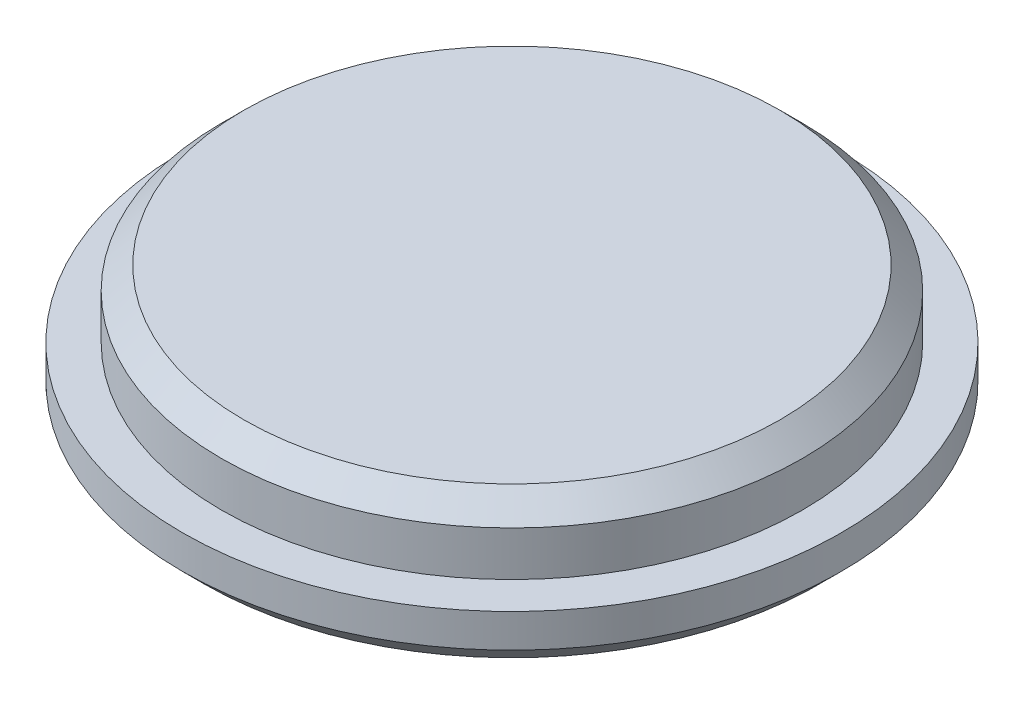
ISO-10303-21;
HEADER;
FILE_DESCRIPTION(('STEP AP214'),'2;1');
FILE_NAME('part.step','',(''),(''),'','','');
FILE_SCHEMA(('AUTOMOTIVE_DESIGN { 1 0 10303 214 1 1 1 1 }'));
ENDSEC;
DATA;
#1=APPLICATION_CONTEXT('core data for automotive mechanical design processes');
#2=APPLICATION_PROTOCOL_DEFINITION('international standard','automotive_design',2000,#1);
#3=PRODUCT_CONTEXT('',#1,'mechanical');
#4=PRODUCT('Part','Part','',(#3));
#5=PRODUCT_RELATED_PRODUCT_CATEGORY('part','',(#4));
#6=PRODUCT_DEFINITION_FORMATION('','',#4);
#7=PRODUCT_DEFINITION_CONTEXT('part definition',#1,'design');
#8=PRODUCT_DEFINITION('design','',#6,#7);
#9=PRODUCT_DEFINITION_SHAPE('','',#8);
#10=(LENGTH_UNIT() NAMED_UNIT(*) SI_UNIT(.MILLI.,.METRE.));
#11=(NAMED_UNIT(*) PLANE_ANGLE_UNIT() SI_UNIT($,.RADIAN.));
#12=(NAMED_UNIT(*) SI_UNIT($,.STERADIAN.) SOLID_ANGLE_UNIT());
#13=UNCERTAINTY_MEASURE_WITH_UNIT(LENGTH_MEASURE(1.E-05),#10,'distance_accuracy_value','');
#14=(GEOMETRIC_REPRESENTATION_CONTEXT(3) GLOBAL_UNCERTAINTY_ASSIGNED_CONTEXT((#13)) GLOBAL_UNIT_ASSIGNED_CONTEXT((#10,
#11,#12)) REPRESENTATION_CONTEXT('',''));
#15=CARTESIAN_POINT('',(0.,0.,0.));
#16=DIRECTION('',(0.,0.,1.));
#17=DIRECTION('',(1.,0.,0.));
#18=AXIS2_PLACEMENT_3D('',#15,#16,#17);
#19=CARTESIAN_POINT('',(0.,0.,0.));
#20=DIRECTION('',(0.,1.,0.));
#21=DIRECTION('',(0.,0.,1.));
#22=AXIS2_PLACEMENT_3D('',#19,#20,#21);
#23=PLANE('',#22);
#24=CARTESIAN_POINT('',(0.,0.,0.));
#25=DIRECTION('',(0.,1.,0.));
#26=DIRECTION('',(0.,0.,1.));
#27=AXIS2_PLACEMENT_3D('',#24,#25,#26);
#28=CIRCLE('',#27,27.5);
#29=CARTESIAN_POINT('',(0.,0.,27.5));
#30=VERTEX_POINT('',#29);
#31=EDGE_CURVE('E10',#30,#30,#28,.T.);
#32=ORIENTED_EDGE('',*,*,#31,.F.);
#33=EDGE_LOOP('',(#32));
#34=FACE_BOUND('',#33,.T.);
#35=ADVANCED_FACE('F43',(#34),#23,.F.);
#36=CARTESIAN_POINT('',(0.,0.,0.));
#37=DIRECTION('',(0.,1.,0.));
#38=DIRECTION('',(0.,0.,1.));
#39=AXIS2_PLACEMENT_3D('',#36,#37,#38);
#40=CONICAL_SURFACE('',#39,27.5,0.785398163397448);
#41=CARTESIAN_POINT('',(0.,2.,0.));
#42=DIRECTION('',(0.,1.,0.));
#43=DIRECTION('',(0.,0.,1.));
#44=AXIS2_PLACEMENT_3D('',#41,#42,#43);
#45=CIRCLE('',#44,29.5);
#46=CARTESIAN_POINT('',(0.,2.,29.5));
#47=VERTEX_POINT('',#46);
#48=EDGE_CURVE('E50',#47,#47,#45,.T.);
#49=ORIENTED_EDGE('',*,*,#48,.F.);
#50=EDGE_LOOP('',(#49));
#51=FACE_BOUND('',#50,.T.);
#52=ORIENTED_EDGE('',*,*,#31,.T.);
#53=EDGE_LOOP('',(#52));
#54=FACE_BOUND('',#53,.T.);
#55=ADVANCED_FACE('F97',(#51,#54),#40,.T.);
#56=CARTESIAN_POINT('',(0.,0.,0.));
#57=DIRECTION('',(0.,1.,0.));
#58=DIRECTION('',(0.,0.,1.));
#59=AXIS2_PLACEMENT_3D('',#56,#57,#58);
#60=CYLINDRICAL_SURFACE('',#59,29.5);
#61=CARTESIAN_POINT('',(0.,5.,0.));
#62=DIRECTION('',(0.,1.,0.));
#63=DIRECTION('',(0.,0.,1.));
#64=AXIS2_PLACEMENT_3D('',#61,#62,#63);
#65=CIRCLE('',#64,29.5);
#66=CARTESIAN_POINT('',(0.,5.,29.5));
#67=VERTEX_POINT('',#66);
#68=EDGE_CURVE('E55',#67,#67,#65,.T.);
#69=ORIENTED_EDGE('',*,*,#68,.F.);
#70=EDGE_LOOP('',(#69));
#71=FACE_BOUND('',#70,.T.);
#72=ORIENTED_EDGE('',*,*,#48,.T.);
#73=EDGE_LOOP('',(#72));
#74=FACE_BOUND('',#73,.T.);
#75=ADVANCED_FACE('F92',(#71,#74),#60,.T.);
#76=CARTESIAN_POINT('',(26.,5.,0.));
#77=DIRECTION('',(0.,-1.,0.));
#78=DIRECTION('',(0.,0.,-1.));
#79=AXIS2_PLACEMENT_3D('',#76,#77,#78);
#80=PLANE('',#79);
#81=CARTESIAN_POINT('',(0.,5.,0.));
#82=DIRECTION('',(0.,1.,0.));
#83=DIRECTION('',(0.,0.,1.));
#84=AXIS2_PLACEMENT_3D('',#81,#82,#83);
#85=CIRCLE('',#84,26.);
#86=CARTESIAN_POINT('',(0.,5.,26.));
#87=VERTEX_POINT('',#86);
#88=EDGE_CURVE('E60',#87,#87,#85,.T.);
#89=ORIENTED_EDGE('',*,*,#88,.F.);
#90=EDGE_LOOP('',(#89));
#91=FACE_BOUND('',#90,.T.);
#92=ORIENTED_EDGE('',*,*,#68,.T.);
#93=EDGE_LOOP('',(#92));
#94=FACE_BOUND('',#93,.T.);
#95=ADVANCED_FACE('F86',(#91,#94),#80,.F.);
#96=CARTESIAN_POINT('',(0.,0.,0.));
#97=DIRECTION('',(0.,1.,0.));
#98=DIRECTION('',(0.,0.,1.));
#99=AXIS2_PLACEMENT_3D('',#96,#97,#98);
#100=CYLINDRICAL_SURFACE('',#99,26.);
#101=CARTESIAN_POINT('',(0.,9.,0.));
#102=DIRECTION('',(0.,1.,0.));
#103=DIRECTION('',(0.,0.,1.));
#104=AXIS2_PLACEMENT_3D('',#101,#102,#103);
#105=CIRCLE('',#104,26.);
#106=CARTESIAN_POINT('',(0.,9.,26.));
#107=VERTEX_POINT('',#106);
#108=EDGE_CURVE('E66',#107,#107,#105,.T.);
#109=ORIENTED_EDGE('',*,*,#108,.F.);
#110=EDGE_LOOP('',(#109));
#111=FACE_BOUND('',#110,.T.);
#112=ORIENTED_EDGE('',*,*,#88,.T.);
#113=EDGE_LOOP('',(#112));
#114=FACE_BOUND('',#113,.T.);
#115=ADVANCED_FACE('F80',(#111,#114),#100,.T.);
#116=CARTESIAN_POINT('',(0.,9.,0.));
#117=DIRECTION('',(0.,-1.,0.));
#118=DIRECTION('',(0.,0.,-1.));
#119=AXIS2_PLACEMENT_3D('',#116,#117,#118);
#120=CONICAL_SURFACE('',#119,26.,0.785398163397448);
#121=CARTESIAN_POINT('',(0.,11.,0.));
#122=DIRECTION('',(0.,1.,0.));
#123=DIRECTION('',(0.,0.,1.));
#124=AXIS2_PLACEMENT_3D('',#121,#122,#123);
#125=CIRCLE('',#124,24.);
#126=CARTESIAN_POINT('',(0.,11.,24.));
#127=VERTEX_POINT('',#126);
#128=EDGE_CURVE('E70',#127,#127,#125,.T.);
#129=ORIENTED_EDGE('',*,*,#128,.F.);
#130=EDGE_LOOP('',(#129));
#131=FACE_BOUND('',#130,.T.);
#132=ORIENTED_EDGE('',*,*,#108,.T.);
#133=EDGE_LOOP('',(#132));
#134=FACE_BOUND('',#133,.T.);
#135=ADVANCED_FACE('F77',(#131,#134),#120,.T.);
#136=CARTESIAN_POINT('',(24.,11.,0.));
#137=DIRECTION('',(0.,-1.,0.));
#138=DIRECTION('',(0.,0.,-1.));
#139=AXIS2_PLACEMENT_3D('',#136,#137,#138);
#140=PLANE('',#139);
#141=ORIENTED_EDGE('',*,*,#128,.T.);
#142=EDGE_LOOP('',(#141));
#143=FACE_BOUND('',#142,.T.);
#144=ADVANCED_FACE('F75',(#143),#140,.F.);
#145=CLOSED_SHELL('',(#35,#55,#75,#95,#115,#135,#144));
#146=MANIFOLD_SOLID_BREP('B2',#145);
#147=ADVANCED_BREP_SHAPE_REPRESENTATION('',(#18,#146),#14);
#148=SHAPE_DEFINITION_REPRESENTATION(#9,#147);
ENDSEC;
END-ISO-10303-21;
